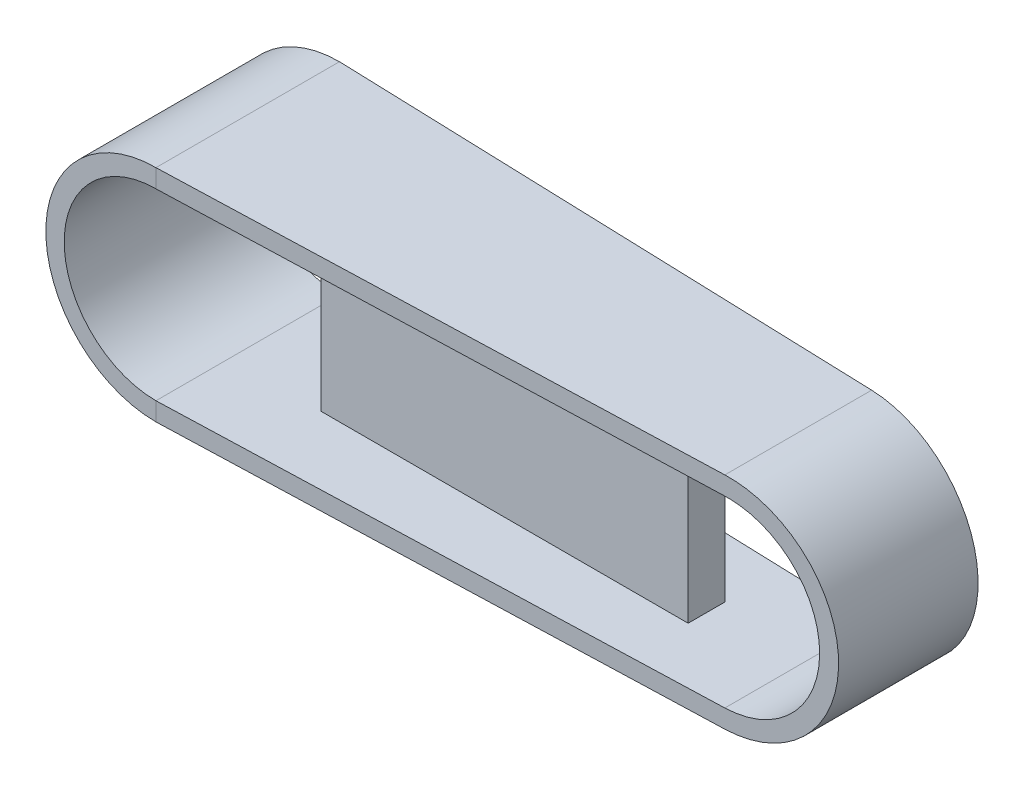
ISO-10303-21;
HEADER;
FILE_DESCRIPTION(('STEP AP214'),'2;1');
FILE_NAME('part.step','',(''),(''),'','','');
FILE_SCHEMA(('AUTOMOTIVE_DESIGN { 1 0 10303 214 1 1 1 1 }'));
ENDSEC;
DATA;
#1=APPLICATION_CONTEXT('core data for automotive mechanical design processes');
#2=APPLICATION_PROTOCOL_DEFINITION('international standard','automotive_design',2000,#1);
#3=PRODUCT_CONTEXT('',#1,'mechanical');
#4=PRODUCT('Part','Part','',(#3));
#5=PRODUCT_RELATED_PRODUCT_CATEGORY('part','',(#4));
#6=PRODUCT_DEFINITION_FORMATION('','',#4);
#7=PRODUCT_DEFINITION_CONTEXT('part definition',#1,'design');
#8=PRODUCT_DEFINITION('design','',#6,#7);
#9=PRODUCT_DEFINITION_SHAPE('','',#8);
#10=(LENGTH_UNIT() NAMED_UNIT(*) SI_UNIT(.MILLI.,.METRE.));
#11=(NAMED_UNIT(*) PLANE_ANGLE_UNIT() SI_UNIT($,.RADIAN.));
#12=(NAMED_UNIT(*) SI_UNIT($,.STERADIAN.) SOLID_ANGLE_UNIT());
#13=UNCERTAINTY_MEASURE_WITH_UNIT(LENGTH_MEASURE(1.E-05),#10,'distance_accuracy_value','');
#14=(GEOMETRIC_REPRESENTATION_CONTEXT(3) GLOBAL_UNCERTAINTY_ASSIGNED_CONTEXT((#13)) GLOBAL_UNIT_ASSIGNED_CONTEXT((#10,
#11,#12)) REPRESENTATION_CONTEXT('',''));
#15=CARTESIAN_POINT('',(0.,0.,0.));
#16=DIRECTION('',(0.,0.,1.));
#17=DIRECTION('',(1.,0.,0.));
#18=AXIS2_PLACEMENT_3D('',#15,#16,#17);
#19=CARTESIAN_POINT('',(-30.,-5.,10.));
#20=DIRECTION('',(0.,1.,0.));
#21=DIRECTION('',(0.,0.,1.));
#22=AXIS2_PLACEMENT_3D('',#19,#20,#21);
#23=PLANE('',#22);
#24=DIRECTION('',(1.,0.,0.));
#25=VECTOR('',#24,1.);
#26=CARTESIAN_POINT('',(-25.,-5.,6.));
#27=LINE('',#26,#25);
#28=CARTESIAN_POINT('',(-25.,-5.,6.));
#29=VERTEX_POINT('',#28);
#30=CARTESIAN_POINT('',(-5.,-5.,6.));
#31=VERTEX_POINT('',#30);
#32=EDGE_CURVE('E212',#29,#31,#27,.T.);
#33=ORIENTED_EDGE('',*,*,#32,.F.);
#34=DIRECTION('',(0.,0.,1.));
#35=VECTOR('',#34,1.);
#36=CARTESIAN_POINT('',(-25.,-5.,6.));
#37=LINE('',#36,#35);
#38=CARTESIAN_POINT('',(-25.,-5.,4.));
#39=VERTEX_POINT('',#38);
#40=EDGE_CURVE('E214',#39,#29,#37,.T.);
#41=ORIENTED_EDGE('',*,*,#40,.F.);
#42=DIRECTION('',(-1.,0.,0.));
#43=VECTOR('',#42,1.);
#44=CARTESIAN_POINT('',(-25.,-5.,4.));
#45=LINE('',#44,#43);
#46=CARTESIAN_POINT('',(-5.,-5.,4.));
#47=VERTEX_POINT('',#46);
#48=EDGE_CURVE('E206',#47,#39,#45,.T.);
#49=ORIENTED_EDGE('',*,*,#48,.F.);
#50=DIRECTION('',(0.,0.,-1.));
#51=VECTOR('',#50,1.);
#52=CARTESIAN_POINT('',(-5.,-5.,6.));
#53=LINE('',#52,#51);
#54=EDGE_CURVE('E209',#31,#47,#53,.T.);
#55=ORIENTED_EDGE('',*,*,#54,.F.);
#56=EDGE_LOOP('',(#33,#41,#49,#55));
#57=FACE_BOUND('',#56,.T.);
#58=DIRECTION('',(0.,0.,-1.));
#59=VECTOR('',#58,1.);
#60=CARTESIAN_POINT('',(0.,-5.,10.));
#61=LINE('',#60,#59);
#62=CARTESIAN_POINT('',(0.,-5.,9.));
#63=VERTEX_POINT('',#62);
#64=CARTESIAN_POINT('',(0.,-5.,0.999999999999999));
#65=VERTEX_POINT('',#64);
#66=EDGE_CURVE('E167',#63,#65,#61,.T.);
#67=ORIENTED_EDGE('',*,*,#66,.T.);
#68=DIRECTION('',(-0.999444906979154,0.,-0.0333148302326384));
#69=VECTOR('',#68,1.);
#70=CARTESIAN_POINT('',(-29.6670366259711,-5.,0.0110987791342963));
#71=LINE('',#70,#69);
#72=CARTESIAN_POINT('',(-30.,-5.,0.));
#73=VERTEX_POINT('',#72);
#74=EDGE_CURVE('E60',#65,#73,#71,.T.);
#75=ORIENTED_EDGE('',*,*,#74,.T.);
#76=DIRECTION('',(0.,0.,-1.));
#77=VECTOR('',#76,1.);
#78=CARTESIAN_POINT('',(-30.,-5.,10.));
#79=LINE('',#78,#77);
#80=CARTESIAN_POINT('',(-30.,-5.,10.));
#81=VERTEX_POINT('',#80);
#82=EDGE_CURVE('E162',#81,#73,#79,.T.);
#83=ORIENTED_EDGE('',*,*,#82,.F.);
#84=DIRECTION('',(0.999444906979154,0.,-0.0333148302326385));
#85=VECTOR('',#84,1.);
#86=CARTESIAN_POINT('',(-30.,-5.,10.));
#87=LINE('',#86,#85);
#88=EDGE_CURVE('E237',#81,#63,#87,.T.);
#89=ORIENTED_EDGE('',*,*,#88,.T.);
#90=EDGE_LOOP('',(#67,#75,#83,#89));
#91=FACE_BOUND('',#90,.T.);
#92=ADVANCED_FACE('F37',(#57,#91),#23,.T.);
#93=CARTESIAN_POINT('',(-30.,5.,10.));
#94=DIRECTION('',(0.,-1.,0.));
#95=DIRECTION('',(0.,0.,-1.));
#96=AXIS2_PLACEMENT_3D('',#93,#94,#95);
#97=PLANE('',#96);
#98=DIRECTION('',(-1.,0.,0.));
#99=VECTOR('',#98,1.);
#100=CARTESIAN_POINT('',(-25.,5.,4.));
#101=LINE('',#100,#99);
#102=CARTESIAN_POINT('',(-5.,5.,4.));
#103=VERTEX_POINT('',#102);
#104=CARTESIAN_POINT('',(-25.,5.,4.));
#105=VERTEX_POINT('',#104);
#106=EDGE_CURVE('E205',#103,#105,#101,.T.);
#107=ORIENTED_EDGE('',*,*,#106,.T.);
#108=DIRECTION('',(0.,0.,1.));
#109=VECTOR('',#108,1.);
#110=CARTESIAN_POINT('',(-25.,5.,6.));
#111=LINE('',#110,#109);
#112=CARTESIAN_POINT('',(-25.,5.,6.));
#113=VERTEX_POINT('',#112);
#114=EDGE_CURVE('E208',#105,#113,#111,.T.);
#115=ORIENTED_EDGE('',*,*,#114,.T.);
#116=DIRECTION('',(1.,0.,0.));
#117=VECTOR('',#116,1.);
#118=CARTESIAN_POINT('',(-25.,5.,6.));
#119=LINE('',#118,#117);
#120=CARTESIAN_POINT('',(-5.,5.,6.));
#121=VERTEX_POINT('',#120);
#122=EDGE_CURVE('E223',#113,#121,#119,.T.);
#123=ORIENTED_EDGE('',*,*,#122,.T.);
#124=DIRECTION('',(0.,0.,-1.));
#125=VECTOR('',#124,1.);
#126=CARTESIAN_POINT('',(-5.,5.,6.));
#127=LINE('',#126,#125);
#128=EDGE_CURVE('E220',#121,#103,#127,.T.);
#129=ORIENTED_EDGE('',*,*,#128,.T.);
#130=EDGE_LOOP('',(#107,#115,#123,#129));
#131=FACE_BOUND('',#130,.T.);
#132=DIRECTION('',(0.,0.,-1.));
#133=VECTOR('',#132,1.);
#134=CARTESIAN_POINT('',(-30.,5.,10.));
#135=LINE('',#134,#133);
#136=CARTESIAN_POINT('',(-30.,5.,10.));
#137=VERTEX_POINT('',#136);
#138=CARTESIAN_POINT('',(-30.,4.99999999999999,0.));
#139=VERTEX_POINT('',#138);
#140=EDGE_CURVE('E185',#137,#139,#135,.T.);
#141=ORIENTED_EDGE('',*,*,#140,.T.);
#142=DIRECTION('',(0.999444906979154,0.,0.0333148302326384));
#143=VECTOR('',#142,1.);
#144=CARTESIAN_POINT('',(-29.6670366259711,5.,0.0110987791342963));
#145=LINE('',#144,#143);
#146=CARTESIAN_POINT('',(0.,5.,0.999999999999999));
#147=VERTEX_POINT('',#146);
#148=EDGE_CURVE('E129',#139,#147,#145,.T.);
#149=ORIENTED_EDGE('',*,*,#148,.T.);
#150=DIRECTION('',(0.,0.,-1.));
#151=VECTOR('',#150,1.);
#152=CARTESIAN_POINT('',(0.,5.,10.));
#153=LINE('',#152,#151);
#154=CARTESIAN_POINT('',(0.,5.,9.));
#155=VERTEX_POINT('',#154);
#156=EDGE_CURVE('E178',#155,#147,#153,.T.);
#157=ORIENTED_EDGE('',*,*,#156,.F.);
#158=DIRECTION('',(-0.999444906979154,0.,0.0333148302326385));
#159=VECTOR('',#158,1.);
#160=CARTESIAN_POINT('',(-30.,5.,10.));
#161=LINE('',#160,#159);
#162=EDGE_CURVE('E52',#155,#137,#161,.T.);
#163=ORIENTED_EDGE('',*,*,#162,.T.);
#164=EDGE_LOOP('',(#141,#149,#157,#163));
#165=FACE_BOUND('',#164,.T.);
#166=ADVANCED_FACE('F183',(#131,#165),#97,.T.);
#167=CARTESIAN_POINT('',(0.,0.,10.));
#168=DIRECTION('',(0.,0.,1.));
#169=DIRECTION('',(1.,0.,0.));
#170=AXIS2_PLACEMENT_3D('',#167,#168,#169);
#171=PLANE('',#170);
#172=CARTESIAN_POINT('',(-30.,0.,10.));
#173=DIRECTION('',(0.,0.,1.));
#174=DIRECTION('',(1.,0.,0.));
#175=AXIS2_PLACEMENT_3D('',#172,#173,#174);
#176=CIRCLE('',#175,6.);
#177=CARTESIAN_POINT('',(-30.,6.,10.));
#178=VERTEX_POINT('',#177);
#179=CARTESIAN_POINT('',(-30.,-6.,10.));
#180=VERTEX_POINT('',#179);
#181=EDGE_CURVE('E157',#178,#180,#176,.T.);
#182=ORIENTED_EDGE('',*,*,#181,.T.);
#183=DIRECTION('',(0.,1.,0.));
#184=VECTOR('',#183,1.);
#185=CARTESIAN_POINT('',(-30.,-14.,10.));
#186=LINE('',#185,#184);
#187=EDGE_CURVE('E135',#180,#81,#186,.T.);
#188=ORIENTED_EDGE('',*,*,#187,.T.);
#189=CARTESIAN_POINT('',(-30.,0.,10.));
#190=DIRECTION('',(0.,0.,1.));
#191=DIRECTION('',(1.,0.,0.));
#192=AXIS2_PLACEMENT_3D('',#189,#190,#191);
#193=CIRCLE('',#192,5.);
#194=EDGE_CURVE('E188',#137,#81,#193,.T.);
#195=ORIENTED_EDGE('',*,*,#194,.F.);
#196=EDGE_CURVE('E147',#137,#178,#186,.T.);
#197=ORIENTED_EDGE('',*,*,#196,.T.);
#198=EDGE_LOOP('',(#182,#188,#195,#197));
#199=FACE_BOUND('',#198,.T.);
#200=ADVANCED_FACE('F251',(#199),#171,.T.);
#201=CARTESIAN_POINT('',(0.,0.,0.));
#202=DIRECTION('',(0.,0.,1.));
#203=DIRECTION('',(1.,0.,0.));
#204=AXIS2_PLACEMENT_3D('',#201,#202,#203);
#205=PLANE('',#204);
#206=DIRECTION('',(0.,1.,0.));
#207=VECTOR('',#206,1.);
#208=CARTESIAN_POINT('',(-30.,-14.,0.));
#209=LINE('',#208,#207);
#210=CARTESIAN_POINT('',(-30.,-6.,0.));
#211=VERTEX_POINT('',#210);
#212=EDGE_CURVE('E134',#211,#73,#209,.T.);
#213=ORIENTED_EDGE('',*,*,#212,.F.);
#214=CARTESIAN_POINT('',(-30.,0.,0.));
#215=DIRECTION('',(0.,0.,1.));
#216=DIRECTION('',(1.,0.,0.));
#217=AXIS2_PLACEMENT_3D('',#214,#215,#216);
#218=CIRCLE('',#217,6.);
#219=CARTESIAN_POINT('',(-30.,6.,0.));
#220=VERTEX_POINT('',#219);
#221=EDGE_CURVE('E154',#220,#211,#218,.T.);
#222=ORIENTED_EDGE('',*,*,#221,.F.);
#223=EDGE_CURVE('E123',#139,#220,#209,.T.);
#224=ORIENTED_EDGE('',*,*,#223,.F.);
#225=CARTESIAN_POINT('',(-30.,0.,0.));
#226=DIRECTION('',(0.,0.,1.));
#227=DIRECTION('',(1.,0.,0.));
#228=AXIS2_PLACEMENT_3D('',#225,#226,#227);
#229=CIRCLE('',#228,5.);
#230=EDGE_CURVE('E191',#139,#73,#229,.T.);
#231=ORIENTED_EDGE('',*,*,#230,.T.);
#232=EDGE_LOOP('',(#213,#222,#224,#231));
#233=FACE_BOUND('',#232,.T.);
#234=ADVANCED_FACE('F161',(#233),#205,.F.);
#235=CARTESIAN_POINT('',(0.,0.,10.));
#236=DIRECTION('',(0.,0.,-1.));
#237=DIRECTION('',(-1.,0.,0.));
#238=AXIS2_PLACEMENT_3D('',#235,#236,#237);
#239=CYLINDRICAL_SURFACE('',#238,6.);
#240=CARTESIAN_POINT('',(0.,0.,0.999999999999999));
#241=DIRECTION('',(0.0333148302326384,0.,-0.999444906979154));
#242=DIRECTION('',(-0.999444906979154,0.,-0.0333148302326384));
#243=AXIS2_PLACEMENT_3D('',#240,#241,#242);
#244=ELLIPSE('',#243,6.00333240792145,6.);
#245=CARTESIAN_POINT('',(0.,6.,0.999999999999997));
#246=VERTEX_POINT('',#245);
#247=CARTESIAN_POINT('',(0.,-6.,1.));
#248=VERTEX_POINT('',#247);
#249=EDGE_CURVE('E217',#246,#248,#244,.T.);
#250=ORIENTED_EDGE('',*,*,#249,.F.);
#251=DIRECTION('',(0.,0.,-1.));
#252=VECTOR('',#251,1.);
#253=CARTESIAN_POINT('',(0.,6.,10.));
#254=LINE('',#253,#252);
#255=CARTESIAN_POINT('',(0.,6.,9.));
#256=VERTEX_POINT('',#255);
#257=EDGE_CURVE('E146',#256,#246,#254,.T.);
#258=ORIENTED_EDGE('',*,*,#257,.F.);
#259=CARTESIAN_POINT('',(0.,0.,9.));
#260=DIRECTION('',(0.0333148302326385,0.,0.999444906979154));
#261=DIRECTION('',(0.999444906979154,0.,-0.0333148302326385));
#262=AXIS2_PLACEMENT_3D('',#259,#260,#261);
#263=ELLIPSE('',#262,6.00333240792145,6.);
#264=CARTESIAN_POINT('',(0.,-6.,9.));
#265=VERTEX_POINT('',#264);
#266=EDGE_CURVE('E233',#265,#256,#263,.T.);
#267=ORIENTED_EDGE('',*,*,#266,.F.);
#268=DIRECTION('',(0.,0.,-1.));
#269=VECTOR('',#268,1.);
#270=CARTESIAN_POINT('',(0.,-6.,10.));
#271=LINE('',#270,#269);
#272=EDGE_CURVE('E164',#265,#248,#271,.T.);
#273=ORIENTED_EDGE('',*,*,#272,.T.);
#274=EDGE_LOOP('',(#250,#258,#267,#273));
#275=FACE_BOUND('',#274,.T.);
#276=ADVANCED_FACE('F39',(#275),#239,.T.);
#277=CARTESIAN_POINT('',(0.,6.,10.));
#278=DIRECTION('',(0.,-1.,0.));
#279=DIRECTION('',(1.,0.,0.));
#280=AXIS2_PLACEMENT_3D('',#277,#278,#279);
#281=PLANE('',#280);
#282=DIRECTION('',(-0.999444906979154,0.,-0.0333148302326384));
#283=VECTOR('',#282,1.);
#284=CARTESIAN_POINT('',(120.,6.00000000000001,4.99999999999999));
#285=LINE('',#284,#283);
#286=EDGE_CURVE('E126',#246,#220,#285,.T.);
#287=ORIENTED_EDGE('',*,*,#286,.T.);
#288=DIRECTION('',(0.,0.,-1.));
#289=VECTOR('',#288,1.);
#290=CARTESIAN_POINT('',(-30.,6.,10.));
#291=LINE('',#290,#289);
#292=EDGE_CURVE('E143',#178,#220,#291,.T.);
#293=ORIENTED_EDGE('',*,*,#292,.F.);
#294=DIRECTION('',(0.999444906979154,0.,-0.0333148302326386));
#295=VECTOR('',#294,1.);
#296=CARTESIAN_POINT('',(-30.,6.,10.));
#297=LINE('',#296,#295);
#298=EDGE_CURVE('E148',#178,#256,#297,.T.);
#299=ORIENTED_EDGE('',*,*,#298,.T.);
#300=ORIENTED_EDGE('',*,*,#257,.T.);
#301=EDGE_LOOP('',(#287,#293,#299,#300));
#302=FACE_BOUND('',#301,.T.);
#303=ADVANCED_FACE('F141',(#302),#281,.F.);
#304=CARTESIAN_POINT('',(0.,-6.,10.));
#305=DIRECTION('',(0.,1.,0.));
#306=DIRECTION('',(-1.,0.,0.));
#307=AXIS2_PLACEMENT_3D('',#304,#305,#306);
#308=PLANE('',#307);
#309=DIRECTION('',(-0.999444906979154,0.,-0.0333148302326384));
#310=VECTOR('',#309,1.);
#311=CARTESIAN_POINT('',(0.299667036625971,-6.,1.00998890122087));
#312=LINE('',#311,#310);
#313=EDGE_CURVE('E229',#248,#211,#312,.T.);
#314=ORIENTED_EDGE('',*,*,#313,.F.);
#315=ORIENTED_EDGE('',*,*,#272,.F.);
#316=DIRECTION('',(0.999444906979154,0.,-0.0333148302326385));
#317=VECTOR('',#316,1.);
#318=CARTESIAN_POINT('',(-0.0332963374028851,-6.,9.00110987791343));
#319=LINE('',#318,#317);
#320=EDGE_CURVE('E235',#180,#265,#319,.T.);
#321=ORIENTED_EDGE('',*,*,#320,.F.);
#322=DIRECTION('',(0.,0.,-1.));
#323=VECTOR('',#322,1.);
#324=CARTESIAN_POINT('',(-30.,-6.,10.));
#325=LINE('',#324,#323);
#326=EDGE_CURVE('E158',#180,#211,#325,.T.);
#327=ORIENTED_EDGE('',*,*,#326,.T.);
#328=EDGE_LOOP('',(#314,#315,#321,#327));
#329=FACE_BOUND('',#328,.T.);
#330=ADVANCED_FACE('F247',(#329),#308,.F.);
#331=CARTESIAN_POINT('',(0.,0.,10.));
#332=DIRECTION('',(0.,0.,-1.));
#333=DIRECTION('',(-1.,0.,0.));
#334=AXIS2_PLACEMENT_3D('',#331,#332,#333);
#335=CYLINDRICAL_SURFACE('',#334,5.);
#336=ORIENTED_EDGE('',*,*,#156,.T.);
#337=CARTESIAN_POINT('',(0.,0.,0.999999999999999));
#338=DIRECTION('',(0.0333148302326384,0.,-0.999444906979154));
#339=DIRECTION('',(-0.999444906979154,0.,-0.0333148302326384));
#340=AXIS2_PLACEMENT_3D('',#337,#338,#339);
#341=ELLIPSE('',#340,5.00277700660121,5.);
#342=EDGE_CURVE('E12',#147,#65,#341,.T.);
#343=ORIENTED_EDGE('',*,*,#342,.T.);
#344=ORIENTED_EDGE('',*,*,#66,.F.);
#345=CARTESIAN_POINT('',(0.,0.,9.));
#346=DIRECTION('',(0.0333148302326385,0.,0.999444906979154));
#347=DIRECTION('',(0.999444906979154,0.,-0.0333148302326385));
#348=AXIS2_PLACEMENT_3D('',#345,#346,#347);
#349=ELLIPSE('',#348,5.00277700660121,5.);
#350=EDGE_CURVE('E45',#63,#155,#349,.T.);
#351=ORIENTED_EDGE('',*,*,#350,.T.);
#352=EDGE_LOOP('',(#336,#343,#344,#351));
#353=FACE_BOUND('',#352,.T.);
#354=ADVANCED_FACE('F177',(#353),#335,.F.);
#355=CARTESIAN_POINT('',(-30.,0.,10.));
#356=DIRECTION('',(0.,0.,-1.));
#357=DIRECTION('',(-1.,0.,0.));
#358=AXIS2_PLACEMENT_3D('',#355,#356,#357);
#359=CYLINDRICAL_SURFACE('',#358,6.);
#360=ORIENTED_EDGE('',*,*,#221,.T.);
#361=ORIENTED_EDGE('',*,*,#326,.F.);
#362=ORIENTED_EDGE('',*,*,#181,.F.);
#363=ORIENTED_EDGE('',*,*,#292,.T.);
#364=EDGE_LOOP('',(#360,#361,#362,#363));
#365=FACE_BOUND('',#364,.T.);
#366=ADVANCED_FACE('F152',(#365),#359,.T.);
#367=CARTESIAN_POINT('',(-30.,0.,10.));
#368=DIRECTION('',(0.,0.,-1.));
#369=DIRECTION('',(-1.,0.,0.));
#370=AXIS2_PLACEMENT_3D('',#367,#368,#369);
#371=CYLINDRICAL_SURFACE('',#370,5.);
#372=ORIENTED_EDGE('',*,*,#230,.F.);
#373=ORIENTED_EDGE('',*,*,#140,.F.);
#374=ORIENTED_EDGE('',*,*,#194,.T.);
#375=ORIENTED_EDGE('',*,*,#82,.T.);
#376=EDGE_LOOP('',(#372,#373,#374,#375));
#377=FACE_BOUND('',#376,.T.);
#378=ADVANCED_FACE('F277',(#377),#371,.F.);
#379=CARTESIAN_POINT('',(-25.,5.,6.));
#380=DIRECTION('',(1.,0.,0.));
#381=DIRECTION('',(0.,0.,-1.));
#382=AXIS2_PLACEMENT_3D('',#379,#380,#381);
#383=PLANE('',#382);
#384=ORIENTED_EDGE('',*,*,#40,.T.);
#385=DIRECTION('',(0.,-1.,0.));
#386=VECTOR('',#385,1.);
#387=CARTESIAN_POINT('',(-25.,5.,6.));
#388=LINE('',#387,#386);
#389=EDGE_CURVE('E193',#113,#29,#388,.T.);
#390=ORIENTED_EDGE('',*,*,#389,.F.);
#391=ORIENTED_EDGE('',*,*,#114,.F.);
#392=DIRECTION('',(0.,-1.,0.));
#393=VECTOR('',#392,1.);
#394=CARTESIAN_POINT('',(-25.,5.,4.));
#395=LINE('',#394,#393);
#396=EDGE_CURVE('E202',#105,#39,#395,.T.);
#397=ORIENTED_EDGE('',*,*,#396,.T.);
#398=EDGE_LOOP('',(#384,#390,#391,#397));
#399=FACE_BOUND('',#398,.T.);
#400=ADVANCED_FACE('F280',(#399),#383,.F.);
#401=CARTESIAN_POINT('',(-25.,5.,6.));
#402=DIRECTION('',(0.,0.,-1.));
#403=DIRECTION('',(-1.,0.,0.));
#404=AXIS2_PLACEMENT_3D('',#401,#402,#403);
#405=PLANE('',#404);
#406=ORIENTED_EDGE('',*,*,#32,.T.);
#407=DIRECTION('',(0.,-1.,0.));
#408=VECTOR('',#407,1.);
#409=CARTESIAN_POINT('',(-5.,5.,6.));
#410=LINE('',#409,#408);
#411=EDGE_CURVE('E197',#121,#31,#410,.T.);
#412=ORIENTED_EDGE('',*,*,#411,.F.);
#413=ORIENTED_EDGE('',*,*,#122,.F.);
#414=ORIENTED_EDGE('',*,*,#389,.T.);
#415=EDGE_LOOP('',(#406,#412,#413,#414));
#416=FACE_BOUND('',#415,.T.);
#417=ADVANCED_FACE('F328',(#416),#405,.F.);
#418=CARTESIAN_POINT('',(-5.,5.,6.));
#419=DIRECTION('',(-1.,0.,0.));
#420=DIRECTION('',(0.,0.,1.));
#421=AXIS2_PLACEMENT_3D('',#418,#419,#420);
#422=PLANE('',#421);
#423=ORIENTED_EDGE('',*,*,#54,.T.);
#424=DIRECTION('',(0.,-1.,0.));
#425=VECTOR('',#424,1.);
#426=CARTESIAN_POINT('',(-5.,5.,4.));
#427=LINE('',#426,#425);
#428=EDGE_CURVE('E200',#103,#47,#427,.T.);
#429=ORIENTED_EDGE('',*,*,#428,.F.);
#430=ORIENTED_EDGE('',*,*,#128,.F.);
#431=ORIENTED_EDGE('',*,*,#411,.T.);
#432=EDGE_LOOP('',(#423,#429,#430,#431));
#433=FACE_BOUND('',#432,.T.);
#434=ADVANCED_FACE('F262',(#433),#422,.F.);
#435=CARTESIAN_POINT('',(-25.,5.,4.));
#436=DIRECTION('',(0.,0.,1.));
#437=DIRECTION('',(1.,0.,0.));
#438=AXIS2_PLACEMENT_3D('',#435,#436,#437);
#439=PLANE('',#438);
#440=ORIENTED_EDGE('',*,*,#48,.T.);
#441=ORIENTED_EDGE('',*,*,#396,.F.);
#442=ORIENTED_EDGE('',*,*,#106,.F.);
#443=ORIENTED_EDGE('',*,*,#428,.T.);
#444=EDGE_LOOP('',(#440,#441,#442,#443));
#445=FACE_BOUND('',#444,.T.);
#446=ADVANCED_FACE('F255',(#445),#439,.F.);
#447=CARTESIAN_POINT('',(-30.,-14.,10.));
#448=DIRECTION('',(0.0333148302326385,0.,0.999444906979154));
#449=DIRECTION('',(0.999444906979154,0.,-0.0333148302326385));
#450=AXIS2_PLACEMENT_3D('',#447,#448,#449);
#451=PLANE('',#450);
#452=ORIENTED_EDGE('',*,*,#266,.T.);
#453=ORIENTED_EDGE('',*,*,#298,.F.);
#454=ORIENTED_EDGE('',*,*,#196,.F.);
#455=ORIENTED_EDGE('',*,*,#162,.F.);
#456=ORIENTED_EDGE('',*,*,#350,.F.);
#457=ORIENTED_EDGE('',*,*,#88,.F.);
#458=ORIENTED_EDGE('',*,*,#187,.F.);
#459=ORIENTED_EDGE('',*,*,#320,.T.);
#460=EDGE_LOOP('',(#452,#453,#454,#455,#456,#457,#458,#459));
#461=FACE_BOUND('',#460,.T.);
#462=ADVANCED_FACE('F253',(#461),#451,.T.);
#463=CARTESIAN_POINT('',(120.,-14.,4.99999999999999));
#464=DIRECTION('',(0.0333148302326384,0.,-0.999444906979154));
#465=DIRECTION('',(-0.999444906979154,0.,-0.0333148302326384));
#466=AXIS2_PLACEMENT_3D('',#463,#464,#465);
#467=PLANE('',#466);
#468=ORIENTED_EDGE('',*,*,#249,.T.);
#469=ORIENTED_EDGE('',*,*,#313,.T.);
#470=ORIENTED_EDGE('',*,*,#212,.T.);
#471=ORIENTED_EDGE('',*,*,#74,.F.);
#472=ORIENTED_EDGE('',*,*,#342,.F.);
#473=ORIENTED_EDGE('',*,*,#148,.F.);
#474=ORIENTED_EDGE('',*,*,#223,.T.);
#475=ORIENTED_EDGE('',*,*,#286,.F.);
#476=EDGE_LOOP('',(#468,#469,#470,#471,#472,#473,#474,#475));
#477=FACE_BOUND('',#476,.T.);
#478=ADVANCED_FACE('F125',(#477),#467,.T.);
#479=CLOSED_SHELL('',(#92,#166,#200,#234,#276,#303,#330,#354,#366,#378,#400,#417,#434,#446,#462,#478));
#480=MANIFOLD_SOLID_BREP('B2',#479);
#481=ADVANCED_BREP_SHAPE_REPRESENTATION('',(#18,#480),#14);
#482=SHAPE_DEFINITION_REPRESENTATION(#9,#481);
ENDSEC;
END-ISO-10303-21;
